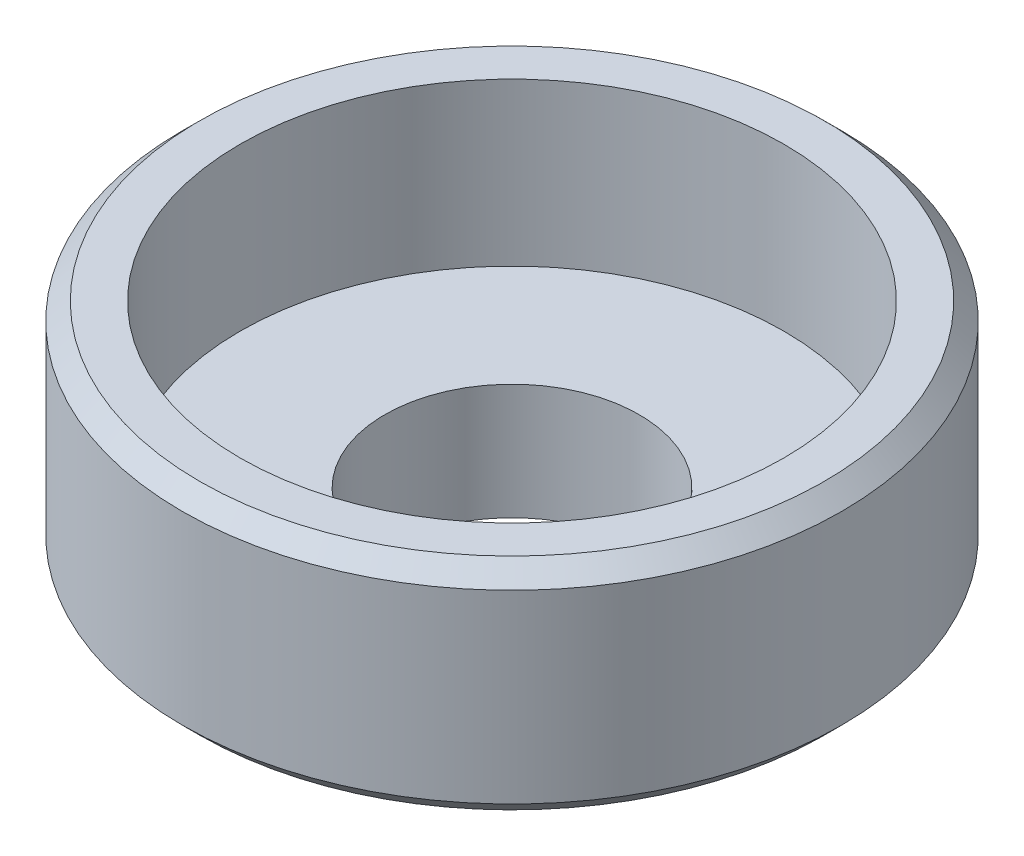
ISO-10303-21;
HEADER;
FILE_DESCRIPTION(('STEP AP214'),'2;1');
FILE_NAME('part.step','',(''),(''),'','','');
FILE_SCHEMA(('AUTOMOTIVE_DESIGN { 1 0 10303 214 1 1 1 1 }'));
ENDSEC;
DATA;
#1=APPLICATION_CONTEXT('core data for automotive mechanical design processes');
#2=APPLICATION_PROTOCOL_DEFINITION('international standard','automotive_design',2000,#1);
#3=PRODUCT_CONTEXT('',#1,'mechanical');
#4=PRODUCT('Part','Part','',(#3));
#5=PRODUCT_RELATED_PRODUCT_CATEGORY('part','',(#4));
#6=PRODUCT_DEFINITION_FORMATION('','',#4);
#7=PRODUCT_DEFINITION_CONTEXT('part definition',#1,'design');
#8=PRODUCT_DEFINITION('design','',#6,#7);
#9=PRODUCT_DEFINITION_SHAPE('','',#8);
#10=(LENGTH_UNIT() NAMED_UNIT(*) SI_UNIT(.MILLI.,.METRE.));
#11=(NAMED_UNIT(*) PLANE_ANGLE_UNIT() SI_UNIT($,.RADIAN.));
#12=(NAMED_UNIT(*) SI_UNIT($,.STERADIAN.) SOLID_ANGLE_UNIT());
#13=UNCERTAINTY_MEASURE_WITH_UNIT(LENGTH_MEASURE(1.E-05),#10,'distance_accuracy_value','');
#14=(GEOMETRIC_REPRESENTATION_CONTEXT(3) GLOBAL_UNCERTAINTY_ASSIGNED_CONTEXT((#13)) GLOBAL_UNIT_ASSIGNED_CONTEXT((#10,
#11,#12)) REPRESENTATION_CONTEXT('',''));
#15=CARTESIAN_POINT('',(0.,0.,0.));
#16=DIRECTION('',(0.,0.,1.));
#17=DIRECTION('',(1.,0.,0.));
#18=AXIS2_PLACEMENT_3D('',#15,#16,#17);
#19=CARTESIAN_POINT('',(0.,19.7711598746081,0.));
#20=DIRECTION('',(0.,1.,0.));
#21=DIRECTION('',(0.,0.,1.));
#22=AXIS2_PLACEMENT_3D('',#19,#20,#21);
#23=CYLINDRICAL_SURFACE('',#22,11.);
#24=CARTESIAN_POINT('',(0.,5.,0.));
#25=DIRECTION('',(0.,1.,0.));
#26=DIRECTION('',(0.,0.,1.));
#27=AXIS2_PLACEMENT_3D('',#24,#25,#26);
#28=CIRCLE('',#27,11.);
#29=CARTESIAN_POINT('',(0.,5.,11.));
#30=VERTEX_POINT('',#29);
#31=EDGE_CURVE('E74',#30,#30,#28,.T.);
#32=ORIENTED_EDGE('',*,*,#31,.T.);
#33=EDGE_LOOP('',(#32));
#34=FACE_BOUND('',#33,.T.);
#35=CARTESIAN_POINT('',(0.,-5.,0.));
#36=DIRECTION('',(0.,1.,0.));
#37=DIRECTION('',(0.,0.,1.));
#38=AXIS2_PLACEMENT_3D('',#35,#36,#37);
#39=CIRCLE('',#38,11.);
#40=CARTESIAN_POINT('',(0.,-5.,11.));
#41=VERTEX_POINT('',#40);
#42=EDGE_CURVE('E62',#41,#41,#39,.T.);
#43=ORIENTED_EDGE('',*,*,#42,.F.);
#44=EDGE_LOOP('',(#43));
#45=FACE_BOUND('',#44,.T.);
#46=ADVANCED_FACE('F35',(#34,#45),#23,.F.);
#47=CARTESIAN_POINT('',(0.,-5.,15.));
#48=DIRECTION('',(0.,-1.,0.));
#49=DIRECTION('',(0.,0.,-1.));
#50=AXIS2_PLACEMENT_3D('',#47,#48,#49);
#51=PLANE('',#50);
#52=CARTESIAN_POINT('',(0.,-5.,0.));
#53=DIRECTION('',(0.,-1.,0.));
#54=DIRECTION('',(0.,0.,-1.));
#55=AXIS2_PLACEMENT_3D('',#52,#53,#54);
#56=CIRCLE('',#55,13.5);
#57=CARTESIAN_POINT('',(0.,-5.,-13.5));
#58=VERTEX_POINT('',#57);
#59=EDGE_CURVE('E56',#58,#58,#56,.T.);
#60=ORIENTED_EDGE('',*,*,#59,.T.);
#61=EDGE_LOOP('',(#60));
#62=FACE_BOUND('',#61,.T.);
#63=ORIENTED_EDGE('',*,*,#42,.T.);
#64=EDGE_LOOP('',(#63));
#65=FACE_BOUND('',#64,.T.);
#66=ADVANCED_FACE('F97',(#62,#65),#51,.T.);
#67=CARTESIAN_POINT('',(0.,19.7711598746081,0.));
#68=DIRECTION('',(0.,1.,0.));
#69=DIRECTION('',(0.,0.,1.));
#70=AXIS2_PLACEMENT_3D('',#67,#68,#69);
#71=CYLINDRICAL_SURFACE('',#70,15.);
#72=CARTESIAN_POINT('',(0.,-3.50000000000003,0.));
#73=DIRECTION('',(0.,-1.,0.));
#74=DIRECTION('',(0.,0.,-1.));
#75=AXIS2_PLACEMENT_3D('',#72,#73,#74);
#76=CIRCLE('',#75,15.);
#77=CARTESIAN_POINT('',(0.,-3.50000000000003,-15.));
#78=VERTEX_POINT('',#77);
#79=EDGE_CURVE('E59',#78,#78,#76,.F.);
#80=ORIENTED_EDGE('',*,*,#79,.T.);
#81=EDGE_LOOP('',(#80));
#82=FACE_BOUND('',#81,.T.);
#83=CARTESIAN_POINT('',(0.,0.,0.));
#84=DIRECTION('',(0.,1.,0.));
#85=DIRECTION('',(0.,0.,1.));
#86=AXIS2_PLACEMENT_3D('',#83,#84,#85);
#87=CIRCLE('',#86,15.);
#88=CARTESIAN_POINT('',(0.,0.,15.));
#89=VERTEX_POINT('',#88);
#90=EDGE_CURVE('E65',#89,#89,#87,.T.);
#91=ORIENTED_EDGE('',*,*,#90,.F.);
#92=EDGE_LOOP('',(#91));
#93=FACE_BOUND('',#92,.T.);
#94=ADVANCED_FACE('F102',(#82,#93),#71,.T.);
#95=CARTESIAN_POINT('',(0.,0.,15.));
#96=DIRECTION('',(0.,-1.,0.));
#97=DIRECTION('',(0.,0.,-1.));
#98=AXIS2_PLACEMENT_3D('',#95,#96,#97);
#99=PLANE('',#98);
#100=CARTESIAN_POINT('',(0.,0.,0.));
#101=DIRECTION('',(0.,-1.,0.));
#102=DIRECTION('',(0.,0.,-1.));
#103=AXIS2_PLACEMENT_3D('',#100,#101,#102);
#104=CIRCLE('',#103,27.);
#105=CARTESIAN_POINT('',(0.,0.,27.));
#106=VERTEX_POINT('',#105);
#107=EDGE_CURVE('E10',#106,#106,#104,.T.);
#108=ORIENTED_EDGE('',*,*,#107,.T.);
#109=EDGE_LOOP('',(#108));
#110=FACE_BOUND('',#109,.T.);
#111=ORIENTED_EDGE('',*,*,#90,.T.);
#112=EDGE_LOOP('',(#111));
#113=FACE_BOUND('',#112,.T.);
#114=ADVANCED_FACE('F131',(#110,#113),#99,.T.);
#115=CARTESIAN_POINT('',(0.,19.7711598746081,0.));
#116=DIRECTION('',(0.,1.,0.));
#117=DIRECTION('',(0.,0.,1.));
#118=AXIS2_PLACEMENT_3D('',#115,#116,#117);
#119=CYLINDRICAL_SURFACE('',#118,28.5);
#120=CARTESIAN_POINT('',(0.,17.5,0.));
#121=DIRECTION('',(0.,1.,0.));
#122=DIRECTION('',(0.,0.,1.));
#123=AXIS2_PLACEMENT_3D('',#120,#121,#122);
#124=CIRCLE('',#123,28.5);
#125=CARTESIAN_POINT('',(0.,17.5,28.5));
#126=VERTEX_POINT('',#125);
#127=EDGE_CURVE('E43',#126,#126,#124,.F.);
#128=ORIENTED_EDGE('',*,*,#127,.T.);
#129=EDGE_LOOP('',(#128));
#130=FACE_BOUND('',#129,.T.);
#131=CARTESIAN_POINT('',(0.,1.49999999999999,0.));
#132=DIRECTION('',(0.,-1.,0.));
#133=DIRECTION('',(0.,0.,-1.));
#134=AXIS2_PLACEMENT_3D('',#131,#132,#133);
#135=CIRCLE('',#134,28.5);
#136=CARTESIAN_POINT('',(0.,1.49999999999999,28.5));
#137=VERTEX_POINT('',#136);
#138=EDGE_CURVE('E47',#137,#137,#135,.F.);
#139=ORIENTED_EDGE('',*,*,#138,.T.);
#140=EDGE_LOOP('',(#139));
#141=FACE_BOUND('',#140,.T.);
#142=ADVANCED_FACE('F123',(#130,#141),#119,.T.);
#143=CARTESIAN_POINT('',(0.,19.,28.5));
#144=DIRECTION('',(0.,1.,0.));
#145=DIRECTION('',(0.,0.,1.));
#146=AXIS2_PLACEMENT_3D('',#143,#144,#145);
#147=PLANE('',#146);
#148=CARTESIAN_POINT('',(0.,19.,0.));
#149=DIRECTION('',(0.,1.,0.));
#150=DIRECTION('',(0.,0.,1.));
#151=AXIS2_PLACEMENT_3D('',#148,#149,#150);
#152=CIRCLE('',#151,27.);
#153=CARTESIAN_POINT('',(0.,19.,27.));
#154=VERTEX_POINT('',#153);
#155=EDGE_CURVE('E51',#154,#154,#152,.T.);
#156=ORIENTED_EDGE('',*,*,#155,.T.);
#157=EDGE_LOOP('',(#156));
#158=FACE_BOUND('',#157,.T.);
#159=CARTESIAN_POINT('',(0.,19.,0.));
#160=DIRECTION('',(0.,1.,0.));
#161=DIRECTION('',(0.,0.,1.));
#162=AXIS2_PLACEMENT_3D('',#159,#160,#161);
#163=CIRCLE('',#162,23.5);
#164=CARTESIAN_POINT('',(0.,19.,23.5));
#165=VERTEX_POINT('',#164);
#166=EDGE_CURVE('E68',#165,#165,#163,.T.);
#167=ORIENTED_EDGE('',*,*,#166,.F.);
#168=EDGE_LOOP('',(#167));
#169=FACE_BOUND('',#168,.T.);
#170=ADVANCED_FACE('F93',(#158,#169),#147,.T.);
#171=CARTESIAN_POINT('',(0.,19.7711598746081,0.));
#172=DIRECTION('',(0.,1.,0.));
#173=DIRECTION('',(0.,0.,1.));
#174=AXIS2_PLACEMENT_3D('',#171,#172,#173);
#175=CYLINDRICAL_SURFACE('',#174,23.5);
#176=ORIENTED_EDGE('',*,*,#166,.T.);
#177=EDGE_LOOP('',(#176));
#178=FACE_BOUND('',#177,.T.);
#179=CARTESIAN_POINT('',(0.,5.,0.));
#180=DIRECTION('',(0.,1.,0.));
#181=DIRECTION('',(0.,0.,1.));
#182=AXIS2_PLACEMENT_3D('',#179,#180,#181);
#183=CIRCLE('',#182,23.5);
#184=CARTESIAN_POINT('',(0.,5.,23.5));
#185=VERTEX_POINT('',#184);
#186=EDGE_CURVE('E71',#185,#185,#183,.T.);
#187=ORIENTED_EDGE('',*,*,#186,.F.);
#188=EDGE_LOOP('',(#187));
#189=FACE_BOUND('',#188,.T.);
#190=ADVANCED_FACE('F83',(#178,#189),#175,.F.);
#191=CARTESIAN_POINT('',(0.,5.,23.5));
#192=DIRECTION('',(0.,1.,0.));
#193=DIRECTION('',(0.,0.,1.));
#194=AXIS2_PLACEMENT_3D('',#191,#192,#193);
#195=PLANE('',#194);
#196=ORIENTED_EDGE('',*,*,#186,.T.);
#197=EDGE_LOOP('',(#196));
#198=FACE_BOUND('',#197,.T.);
#199=ORIENTED_EDGE('',*,*,#31,.F.);
#200=EDGE_LOOP('',(#199));
#201=FACE_BOUND('',#200,.T.);
#202=ADVANCED_FACE('F80',(#198,#201),#195,.T.);
#203=CARTESIAN_POINT('',(0.,-3.50000000000003,0.));
#204=DIRECTION('',(0.,1.,0.));
#205=DIRECTION('',(0.,0.,1.));
#206=AXIS2_PLACEMENT_3D('',#203,#204,#205);
#207=CONICAL_SURFACE('',#206,15.,0.785398163397452);
#208=ORIENTED_EDGE('',*,*,#59,.F.);
#209=EDGE_LOOP('',(#208));
#210=FACE_BOUND('',#209,.T.);
#211=ORIENTED_EDGE('',*,*,#79,.F.);
#212=EDGE_LOOP('',(#211));
#213=FACE_BOUND('',#212,.T.);
#214=ADVANCED_FACE('F82',(#210,#213),#207,.T.);
#215=CARTESIAN_POINT('',(0.,19.,0.));
#216=DIRECTION('',(0.,-1.,0.));
#217=DIRECTION('',(0.,0.,-1.));
#218=AXIS2_PLACEMENT_3D('',#215,#216,#217);
#219=CONICAL_SURFACE('',#218,27.,0.785398163397448);
#220=ORIENTED_EDGE('',*,*,#127,.F.);
#221=EDGE_LOOP('',(#220));
#222=FACE_BOUND('',#221,.T.);
#223=ORIENTED_EDGE('',*,*,#155,.F.);
#224=EDGE_LOOP('',(#223));
#225=FACE_BOUND('',#224,.T.);
#226=ADVANCED_FACE('F90',(#222,#225),#219,.T.);
#227=CARTESIAN_POINT('',(0.,1.49999999999999,0.));
#228=DIRECTION('',(0.,1.,0.));
#229=DIRECTION('',(0.,0.,1.));
#230=AXIS2_PLACEMENT_3D('',#227,#228,#229);
#231=CONICAL_SURFACE('',#230,28.5,0.785398163397451);
#232=CARTESIAN_POINT('',(0.,0.,27.));
#233=CARTESIAN_POINT('',(0.,0.0156250000000006,27.015625));
#234=CARTESIAN_POINT('',(0.,0.0312500000000001,27.03125));
#235=CARTESIAN_POINT('',(0.,0.0624999999999992,27.0625));
#236=CARTESIAN_POINT('',(0.,0.0781249999999988,27.078125));
#237=CARTESIAN_POINT('',(0.,0.109374999999999,27.109375));
#238=CARTESIAN_POINT('',(0.,0.124999999999999,27.125));
#239=CARTESIAN_POINT('',(0.,0.156249999999999,27.15625));
#240=CARTESIAN_POINT('',(0.,0.171874999999998,27.171875));
#241=CARTESIAN_POINT('',(0.,0.203124999999998,27.203125));
#242=CARTESIAN_POINT('',(0.,0.218749999999998,27.21875));
#243=CARTESIAN_POINT('',(0.,0.249999999999998,27.25));
#244=CARTESIAN_POINT('',(0.,0.265624999999998,27.265625));
#245=CARTESIAN_POINT('',(0.,0.296874999999997,27.296875));
#246=CARTESIAN_POINT('',(0.,0.312499999999997,27.3125));
#247=CARTESIAN_POINT('',(0.,0.343749999999997,27.34375));
#248=CARTESIAN_POINT('',(0.,0.359374999999997,27.359375));
#249=CARTESIAN_POINT('',(0.,0.390624999999997,27.390625));
#250=CARTESIAN_POINT('',(0.,0.406249999999996,27.40625));
#251=CARTESIAN_POINT('',(0.,0.437499999999996,27.4375));
#252=CARTESIAN_POINT('',(0.,0.453124999999996,27.453125));
#253=CARTESIAN_POINT('',(0.,0.484374999999996,27.484375));
#254=CARTESIAN_POINT('',(0.,0.499999999999995,27.5));
#255=CARTESIAN_POINT('',(0.,0.531249999999995,27.53125));
#256=CARTESIAN_POINT('',(0.,0.546874999999996,27.546875));
#257=CARTESIAN_POINT('',(0.,0.578124999999995,27.578125));
#258=CARTESIAN_POINT('',(0.,0.593749999999995,27.59375));
#259=CARTESIAN_POINT('',(0.,0.624999999999994,27.625));
#260=CARTESIAN_POINT('',(0.,0.640624999999995,27.640625));
#261=CARTESIAN_POINT('',(0.,0.671874999999995,27.671875));
#262=CARTESIAN_POINT('',(0.,0.687499999999994,27.6875));
#263=CARTESIAN_POINT('',(0.,0.718749999999993,27.71875));
#264=CARTESIAN_POINT('',(0.,0.734374999999993,27.734375));
#265=CARTESIAN_POINT('',(0.,0.765624999999994,27.765625));
#266=CARTESIAN_POINT('',(0.,0.781249999999994,27.78125));
#267=CARTESIAN_POINT('',(0.,0.812499999999993,27.8125));
#268=CARTESIAN_POINT('',(0.,0.828124999999993,27.828125));
#269=CARTESIAN_POINT('',(0.,0.859374999999992,27.859375));
#270=CARTESIAN_POINT('',(0.,0.874999999999993,27.875));
#271=CARTESIAN_POINT('',(0.,0.906249999999993,27.90625));
#272=CARTESIAN_POINT('',(0.,0.921874999999992,27.921875));
#273=CARTESIAN_POINT('',(0.,0.953124999999992,27.953125));
#274=CARTESIAN_POINT('',(0.,0.968749999999992,27.96875));
#275=CARTESIAN_POINT('',(0.,0.999999999999992,28.));
#276=CARTESIAN_POINT('',(0.,1.01562499999999,28.015625));
#277=CARTESIAN_POINT('',(0.,1.04687499999999,28.046875));
#278=CARTESIAN_POINT('',(0.,1.06249999999999,28.0625));
#279=CARTESIAN_POINT('',(0.,1.09374999999999,28.09375));
#280=CARTESIAN_POINT('',(0.,1.10937499999999,28.109375));
#281=CARTESIAN_POINT('',(0.,1.14062499999999,28.140625));
#282=CARTESIAN_POINT('',(0.,1.15624999999999,28.15625));
#283=CARTESIAN_POINT('',(0.,1.18749999999999,28.1875));
#284=CARTESIAN_POINT('',(0.,1.20312499999999,28.203125));
#285=CARTESIAN_POINT('',(0.,1.23437499999999,28.234375));
#286=CARTESIAN_POINT('',(0.,1.24999999999999,28.25));
#287=CARTESIAN_POINT('',(0.,1.28124999999999,28.28125));
#288=CARTESIAN_POINT('',(0.,1.29687499999999,28.296875));
#289=CARTESIAN_POINT('',(0.,1.32812499999999,28.328125));
#290=CARTESIAN_POINT('',(0.,1.34374999999999,28.34375));
#291=CARTESIAN_POINT('',(0.,1.37499999999999,28.375));
#292=CARTESIAN_POINT('',(0.,1.39062499999999,28.390625));
#293=CARTESIAN_POINT('',(0.,1.42187499999999,28.421875));
#294=CARTESIAN_POINT('',(0.,1.43749999999999,28.4375));
#295=CARTESIAN_POINT('',(0.,1.46874999999999,28.46875));
#296=CARTESIAN_POINT('',(0.,1.48437499999999,28.484375));
#297=CARTESIAN_POINT('',(0.,1.49999999999999,28.5));
#298=B_SPLINE_CURVE_WITH_KNOTS('',3,(#232,#233,#234,#235,#236,#237,#238,#239,#240,#241,#242,
#243,#244,#245,#246,#247,#248,#249,#250,#251,#252,#253,#254,#255,#256,#257,#258,#259,#260,#261,
#262,#263,#264,#265,#266,#267,#268,#269,#270,#271,#272,#273,#274,#275,#276,#277,#278,#279,#280,
#281,#282,#283,#284,#285,#286,#287,#288,#289,#290,#291,#292,#293,#294,#295,#296,#297),
.UNSPECIFIED.,.F.,.F.,(4,2,2,2,2,2,2,2,2,2,2,2,2,2,2,2,2,2,2,2,2,2,2,2,2,2,2,2,2,2,2,2,4),(0.,
0.0662912607362374,0.132582521472477,0.198873782208715,0.265165042944954,0.331456303681192,
0.397747564417429,0.464038825153669,0.530330085889906,0.596621346626146,0.662912607362383,
0.729203868098623,0.795495128834861,0.8617863895711,0.928077650307338,0.994368911043578,
1.06066017177981,1.12695143251605,1.19324269325229,1.25953395398853,1.32582521472477,
1.39211647546101,1.45840773619725,1.52469899693348,1.59099025766972,1.65728151840596,
1.7235727791422,1.78986403987844,1.85615530061468,1.92244656135092,1.98873782208715,
2.05502908282339,2.12132034355963),.UNSPECIFIED.);
#299=EDGE_CURVE('BSEAM38',#106,#137,#298,.T.);
#300=ORIENTED_EDGE('',*,*,#107,.F.);
#301=ORIENTED_EDGE('',*,*,#138,.F.);
#302=ORIENTED_EDGE('',*,*,#299,.T.);
#303=ORIENTED_EDGE('',*,*,#299,.F.);
#304=EDGE_LOOP('',(#300,#302,#301,#303));
#305=FACE_BOUND('',#304,.T.);
#306=ADVANCED_FACE('F38',(#305),#231,.T.);
#307=CLOSED_SHELL('',(#46,#66,#94,#114,#142,#170,#190,#202,#214,#226,#306));
#308=MANIFOLD_SOLID_BREP('B2',#307);
#309=ADVANCED_BREP_SHAPE_REPRESENTATION('',(#18,#308),#14);
#310=SHAPE_DEFINITION_REPRESENTATION(#9,#309);
ENDSEC;
END-ISO-10303-21;
